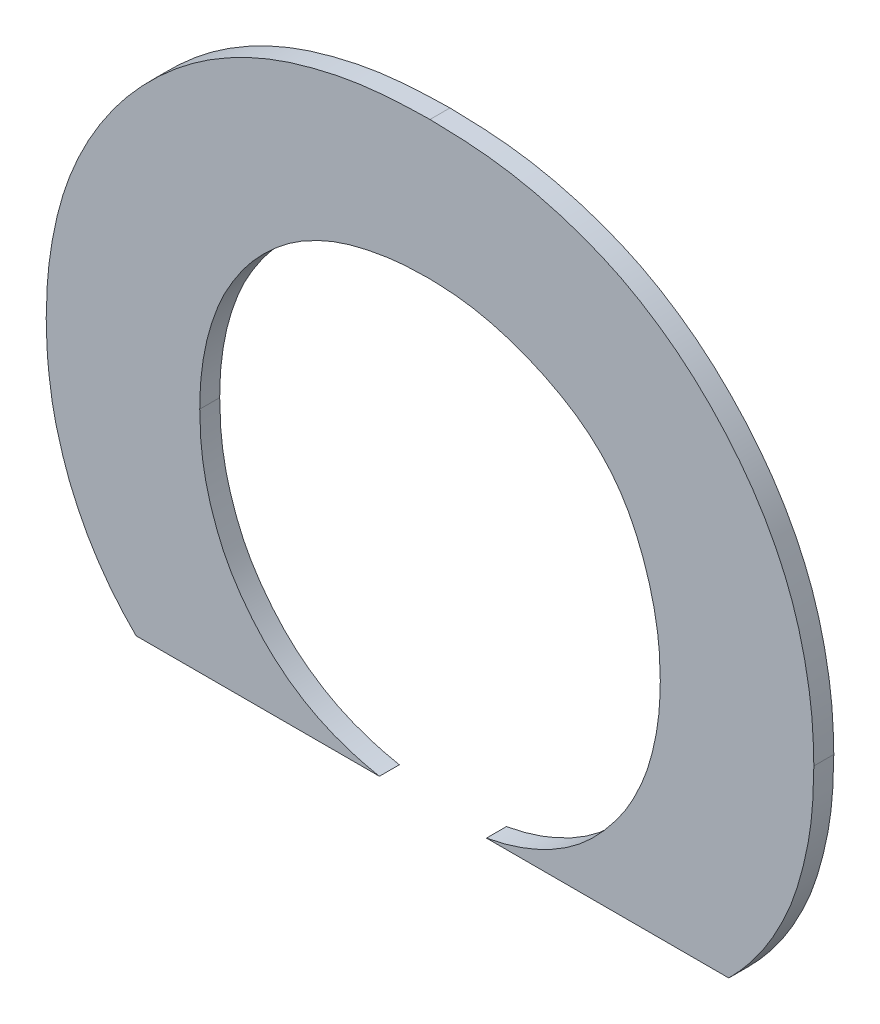
ISO-10303-21;
HEADER;
FILE_DESCRIPTION(('STEP AP214'),'2;1');
FILE_NAME('part.step','',(''),(''),'','','');
FILE_SCHEMA(('AUTOMOTIVE_DESIGN { 1 0 10303 214 1 1 1 1 }'));
ENDSEC;
DATA;
#1=APPLICATION_CONTEXT('core data for automotive mechanical design processes');
#2=APPLICATION_PROTOCOL_DEFINITION('international standard','automotive_design',2000,#1);
#3=PRODUCT_CONTEXT('',#1,'mechanical');
#4=PRODUCT('Part','Part','',(#3));
#5=PRODUCT_RELATED_PRODUCT_CATEGORY('part','',(#4));
#6=PRODUCT_DEFINITION_FORMATION('','',#4);
#7=PRODUCT_DEFINITION_CONTEXT('part definition',#1,'design');
#8=PRODUCT_DEFINITION('design','',#6,#7);
#9=PRODUCT_DEFINITION_SHAPE('','',#8);
#10=(LENGTH_UNIT() NAMED_UNIT(*) SI_UNIT(.MILLI.,.METRE.));
#11=(NAMED_UNIT(*) PLANE_ANGLE_UNIT() SI_UNIT($,.RADIAN.));
#12=(NAMED_UNIT(*) SI_UNIT($,.STERADIAN.) SOLID_ANGLE_UNIT());
#13=UNCERTAINTY_MEASURE_WITH_UNIT(LENGTH_MEASURE(1.E-05),#10,'distance_accuracy_value','');
#14=(GEOMETRIC_REPRESENTATION_CONTEXT(3) GLOBAL_UNCERTAINTY_ASSIGNED_CONTEXT((#13)) GLOBAL_UNIT_ASSIGNED_CONTEXT((#10,
#11,#12)) REPRESENTATION_CONTEXT('',''));
#15=CARTESIAN_POINT('',(0.,0.,0.));
#16=DIRECTION('',(0.,0.,1.));
#17=DIRECTION('',(1.,0.,0.));
#18=AXIS2_PLACEMENT_3D('',#15,#16,#17);
#19=CARTESIAN_POINT('',(9.61538461538461,6.16586538461538,0.5));
#20=CARTESIAN_POINT('',(9.61017162462908,5.92537714989007,0.5));
#21=CARTESIAN_POINT('',(9.59994283483099,5.45349762481903,0.5));
#22=CARTESIAN_POINT('',(9.53735152628781,4.76141097311679,0.5));
#23=CARTESIAN_POINT('',(9.41293172761239,4.10165799474069,0.5));
#24=CARTESIAN_POINT('',(9.25165458547047,3.47091623927967,0.5));
#25=CARTESIAN_POINT('',(9.05027258284493,2.86479504470434,0.5));
#26=CARTESIAN_POINT('',(8.78782313358665,2.2946738026183,0.5));
#27=CARTESIAN_POINT('',(8.48825548716103,1.74965475702828,0.5));
#28=CARTESIAN_POINT('',(8.13890804424135,1.23950736888458,0.5));
#29=CARTESIAN_POINT('',(7.74878978926781,0.764905096176397,0.5));
#30=CARTESIAN_POINT('',(7.31863403379012,0.328024675199994,0.5));
#31=CARTESIAN_POINT('',(6.84804691131166,-0.0675054423072277,0.5));
#32=CARTESIAN_POINT('',(6.34223694898483,-0.431443441327208,0.5));
#33=CARTESIAN_POINT('',(5.79254688724079,-0.750846054001856,0.5));
#34=CARTESIAN_POINT('',(5.20111588312258,-1.02413250883794,0.5));
#35=CARTESIAN_POINT('',(4.57631645930077,-1.26879451667326,0.5));
#36=CARTESIAN_POINT('',(4.13981509448959,-1.39186341674693,0.5));
#37=CARTESIAN_POINT('',(3.91826923076923,-1.45432692307692,0.5));
#38=B_SPLINE_CURVE_WITH_KNOTS('',3,(#19,#20,#21,#22,#23,#24,#25,#26,#27,#28,#29,#30,#31,#32,#33,
#34,#35,#36,#37),.UNSPECIFIED.,.F.,.F.,(4,1,1,1,1,1,1,1,1,1,1,1,1,1,1,1,4),(0.,
0.0698365772226825,0.137031447422229,0.201489536275066,0.264549454362492,0.32598430572815,
0.386637715872096,0.446522086796524,0.506375377576361,0.565880030210925,0.624695587639221,
0.684126282552749,0.744168630234222,0.805421484692506,0.868390132151238,0.933201533380567,1.),.UNSPECIFIED.);
#39=DIRECTION('',(0.,0.,1.));
#40=VECTOR('',#39,1.);
#41=SURFACE_OF_LINEAR_EXTRUSION('',#38,#40);
#42=CARTESIAN_POINT('',(9.61538461538461,6.16586538461538,1.));
#43=CARTESIAN_POINT('',(9.61017162462908,5.92537714989007,1.));
#44=CARTESIAN_POINT('',(9.59994283483099,5.45349762481903,1.));
#45=CARTESIAN_POINT('',(9.53735152628781,4.76141097311679,1.));
#46=CARTESIAN_POINT('',(9.41293172761239,4.10165799474069,1.));
#47=CARTESIAN_POINT('',(9.25165458547047,3.47091623927967,1.));
#48=CARTESIAN_POINT('',(9.05027258284493,2.86479504470434,1.));
#49=CARTESIAN_POINT('',(8.78782313358665,2.2946738026183,1.));
#50=CARTESIAN_POINT('',(8.48825548716103,1.74965475702828,1.));
#51=CARTESIAN_POINT('',(8.13890804424135,1.23950736888458,1.));
#52=CARTESIAN_POINT('',(7.74878978926781,0.764905096176397,1.));
#53=CARTESIAN_POINT('',(7.31863403379012,0.328024675199994,1.));
#54=CARTESIAN_POINT('',(6.84804691131166,-0.0675054423072277,1.));
#55=CARTESIAN_POINT('',(6.34223694898483,-0.431443441327208,1.));
#56=CARTESIAN_POINT('',(5.79254688724079,-0.750846054001856,1.));
#57=CARTESIAN_POINT('',(5.20111588312258,-1.02413250883794,1.));
#58=CARTESIAN_POINT('',(4.57631645930077,-1.26879451667326,1.));
#59=CARTESIAN_POINT('',(4.13981509448959,-1.39186341674693,1.));
#60=CARTESIAN_POINT('',(3.91826923076923,-1.45432692307692,1.));
#61=B_SPLINE_CURVE_WITH_KNOTS('',3,(#42,#43,#44,#45,#46,#47,#48,#49,#50,#51,#52,#53,#54,#55,#56,
#57,#58,#59,#60),.UNSPECIFIED.,.F.,.F.,(4,1,1,1,1,1,1,1,1,1,1,1,1,1,1,1,4),(0.,
0.0698365772226825,0.137031447422229,0.201489536275066,0.264549454362492,0.32598430572815,
0.386637715872096,0.446522086796524,0.506375377576361,0.565880030210925,0.624695587639221,
0.684126282552749,0.744168630234222,0.805421484692506,0.868390132151238,0.933201533380567,1.),.UNSPECIFIED.);
#62=CARTESIAN_POINT('',(9.61538461538461,6.16586538461538,1.));
#63=VERTEX_POINT('',#62);
#64=CARTESIAN_POINT('',(7.48417563612663,0.5,1.));
#65=VERTEX_POINT('',#64);
#66=EDGE_CURVE('E43',#63,#65,#61,.T.);
#67=ORIENTED_EDGE('',*,*,#66,.T.);
#68=DIRECTION('',(0.,0.,1.));
#69=VECTOR('',#68,1.);
#70=CARTESIAN_POINT('',(7.48417564454963,0.5,0.5));
#71=LINE('',#70,#69);
#72=CARTESIAN_POINT('',(7.48417563612663,0.5,0.5));
#73=VERTEX_POINT('',#72);
#74=EDGE_CURVE('E58',#65,#73,#71,.F.);
#75=ORIENTED_EDGE('',*,*,#74,.T.);
#76=CARTESIAN_POINT('',(9.61538461538461,6.16586538461538,0.5));
#77=VERTEX_POINT('',#76);
#78=EDGE_CURVE('E160',#77,#73,#38,.T.);
#79=ORIENTED_EDGE('',*,*,#78,.F.);
#80=DIRECTION('',(0.,0.,1.));
#81=VECTOR('',#80,1.);
#82=CARTESIAN_POINT('',(9.61538461538461,6.16586538461538,0.5));
#83=LINE('',#82,#81);
#84=EDGE_CURVE('E131',#77,#63,#83,.T.);
#85=ORIENTED_EDGE('',*,*,#84,.T.);
#86=EDGE_LOOP('',(#67,#75,#79,#85));
#87=FACE_BOUND('',#86,.T.);
#88=ADVANCED_FACE('F39',(#87),#41,.F.);
#89=CARTESIAN_POINT('',(-4.01442307692308,-1.45432692307692,0.5));
#90=CARTESIAN_POINT('',(-4.23841006147737,-1.37833581974484,0.5));
#91=CARTESIAN_POINT('',(-4.67732737328802,-1.22942622634854,0.5));
#92=CARTESIAN_POINT('',(-5.29744459104237,-0.939287095441452,0.5));
#93=CARTESIAN_POINT('',(-5.88122603721763,-0.629518404450239,0.5));
#94=CARTESIAN_POINT('',(-6.42816221732327,-0.285334654211241,0.5));
#95=CARTESIAN_POINT('',(-6.9303959427912,0.0974191148321524,0.5));
#96=CARTESIAN_POINT('',(-7.39139229300819,0.516962040217201,0.5));
#97=CARTESIAN_POINT('',(-7.81400813592569,0.967226277300411,0.5));
#98=CARTESIAN_POINT('',(-8.19167085803598,1.45566899472176,0.5));
#99=CARTESIAN_POINT('',(-8.52930715512637,1.97121734358262,0.5));
#100=CARTESIAN_POINT('',(-8.81698043243783,2.51588224428292,0.5));
#101=CARTESIAN_POINT('',(-9.06683521735972,3.08086066885602,0.5));
#102=CARTESIAN_POINT('',(-9.26066868043604,3.67448546647928,0.5));
#103=CARTESIAN_POINT('',(-9.42945911149872,4.28624964726649,0.5));
#104=CARTESIAN_POINT('',(-9.53195259419776,4.92718367191841,0.5));
#105=CARTESIAN_POINT('',(-9.60111763792179,5.58942430442754,0.5));
#106=CARTESIAN_POINT('',(-9.61057950921133,6.03947539948525,0.5));
#107=CARTESIAN_POINT('',(-9.61538461538462,6.26802884615384,0.5));
#108=B_SPLINE_CURVE_WITH_KNOTS('',3,(#89,#90,#91,#92,#93,#94,#95,#96,#97,#98,#99,#100,#101,#102,
#103,#104,#105,#106,#107),.UNSPECIFIED.,.F.,.F.,(4,1,1,1,1,1,1,1,1,1,1,1,1,1,1,1,4),(0.,
0.0690190400715999,0.135247374271586,0.199628646821953,0.261946501772838,0.323721121180078,
0.383768241952378,0.443781160830443,0.503808332866024,0.563841205217087,0.623508159508567,
0.683498266290824,0.743988251934363,0.805710225263784,0.868604717465862,0.933272366118071,1.),.UNSPECIFIED.);
#109=DIRECTION('',(0.,0.,1.));
#110=VECTOR('',#109,1.);
#111=SURFACE_OF_LINEAR_EXTRUSION('',#108,#110);
#112=CARTESIAN_POINT('',(-7.36253076665304,0.5,0.5));
#113=VERTEX_POINT('',#112);
#114=CARTESIAN_POINT('',(-9.61538461538462,6.26802884615384,0.5));
#115=VERTEX_POINT('',#114);
#116=EDGE_CURVE('E140',#113,#115,#108,.T.);
#117=ORIENTED_EDGE('',*,*,#116,.F.);
#118=DIRECTION('',(0.,0.,1.));
#119=VECTOR('',#118,1.);
#120=CARTESIAN_POINT('',(-7.3625307568974,0.5,0.5));
#121=LINE('',#120,#119);
#122=CARTESIAN_POINT('',(-7.36253076665304,0.5,1.));
#123=VERTEX_POINT('',#122);
#124=EDGE_CURVE('E125',#113,#123,#121,.T.);
#125=ORIENTED_EDGE('',*,*,#124,.T.);
#126=CARTESIAN_POINT('',(-4.01442307692308,-1.45432692307692,1.));
#127=CARTESIAN_POINT('',(-4.23841006147737,-1.37833581974484,1.));
#128=CARTESIAN_POINT('',(-4.67732737328802,-1.22942622634854,1.));
#129=CARTESIAN_POINT('',(-5.29744459104237,-0.939287095441452,1.));
#130=CARTESIAN_POINT('',(-5.88122603721763,-0.629518404450239,1.));
#131=CARTESIAN_POINT('',(-6.42816221732327,-0.285334654211241,1.));
#132=CARTESIAN_POINT('',(-6.9303959427912,0.0974191148321524,1.));
#133=CARTESIAN_POINT('',(-7.39139229300819,0.516962040217201,1.));
#134=CARTESIAN_POINT('',(-7.81400813592569,0.967226277300411,1.));
#135=CARTESIAN_POINT('',(-8.19167085803598,1.45566899472176,1.));
#136=CARTESIAN_POINT('',(-8.52930715512637,1.97121734358262,1.));
#137=CARTESIAN_POINT('',(-8.81698043243783,2.51588224428292,1.));
#138=CARTESIAN_POINT('',(-9.06683521735972,3.08086066885602,1.));
#139=CARTESIAN_POINT('',(-9.26066868043604,3.67448546647928,1.));
#140=CARTESIAN_POINT('',(-9.42945911149872,4.28624964726649,1.));
#141=CARTESIAN_POINT('',(-9.53195259419776,4.92718367191841,1.));
#142=CARTESIAN_POINT('',(-9.60111763792179,5.58942430442754,1.));
#143=CARTESIAN_POINT('',(-9.61057950921133,6.03947539948525,1.));
#144=CARTESIAN_POINT('',(-9.61538461538462,6.26802884615384,1.));
#145=B_SPLINE_CURVE_WITH_KNOTS('',3,(#126,#127,#128,#129,#130,#131,#132,#133,#134,#135,#136,
#137,#138,#139,#140,#141,#142,#143,#144),.UNSPECIFIED.,.F.,.F.,(4,1,1,1,1,1,1,1,1,1,1,1,1,1,1,1,
4),(0.,0.0690190400715999,0.135247374271586,0.199628646821953,0.261946501772838,
0.323721121180078,0.383768241952378,0.443781160830443,0.503808332866024,0.563841205217087,
0.623508159508567,0.683498266290824,0.743988251934363,0.805710225263784,0.868604717465862,
0.933272366118071,1.),.UNSPECIFIED.);
#146=CARTESIAN_POINT('',(-9.61538461538462,6.26802884615384,1.));
#147=VERTEX_POINT('',#146);
#148=EDGE_CURVE('E127',#123,#147,#145,.T.);
#149=ORIENTED_EDGE('',*,*,#148,.T.);
#150=DIRECTION('',(0.,0.,1.));
#151=VECTOR('',#150,1.);
#152=CARTESIAN_POINT('',(-9.61538461538462,6.26802884615384,0.5));
#153=LINE('',#152,#151);
#154=EDGE_CURVE('E147',#115,#147,#153,.T.);
#155=ORIENTED_EDGE('',*,*,#154,.F.);
#156=EDGE_LOOP('',(#117,#125,#149,#155));
#157=FACE_BOUND('',#156,.T.);
#158=ADVANCED_FACE('F143',(#157),#111,.F.);
#159=CARTESIAN_POINT('',(8.17034628619801,1.29686234703216,0.5));
#160=DIRECTION('',(0.,0.,1.));
#161=DIRECTION('',(1.,0.,0.));
#162=AXIS2_PLACEMENT_3D('',#159,#160,#161);
#163=PLANE('',#162);
#164=ORIENTED_EDGE('',*,*,#78,.T.);
#165=DIRECTION('',(-1.,0.,0.));
#166=VECTOR('',#165,1.);
#167=CARTESIAN_POINT('',(8.17034628619801,0.5,0.5));
#168=LINE('',#167,#166);
#169=CARTESIAN_POINT('',(1.41359819597285,0.499999999993376,0.5));
#170=VERTEX_POINT('',#169);
#171=EDGE_CURVE('E142',#73,#170,#168,.T.);
#172=ORIENTED_EDGE('',*,*,#171,.T.);
#173=CARTESIAN_POINT('',(0.0841346153846127,0.384615384615384,0.5));
#174=CARTESIAN_POINT('',(0.298741879628318,0.388503169415151,0.5));
#175=CARTESIAN_POINT('',(0.719438947245277,0.396124438296946,0.5));
#176=CARTESIAN_POINT('',(1.33067914523052,0.476876636018608,0.5));
#177=CARTESIAN_POINT('',(1.90902371745544,0.601588347185802,0.5));
#178=CARTESIAN_POINT('',(2.449089682021,0.781074464624901,0.5));
#179=CARTESIAN_POINT('',(2.95345777052598,1.01310213340004,0.5));
#180=CARTESIAN_POINT('',(3.42585671106122,1.28863408356051,0.5));
#181=CARTESIAN_POINT('',(3.861375885067,1.62209704558198,0.5));
#182=CARTESIAN_POINT('',(4.25527244275843,2.00634923869242,0.5));
#183=CARTESIAN_POINT('',(4.60713141860215,2.42801539449653,0.5));
#184=CARTESIAN_POINT('',(4.92581808877683,2.87129305470533,0.5));
#185=CARTESIAN_POINT('',(5.18030229737912,3.35163686209857,0.5));
#186=CARTESIAN_POINT('',(5.40192120420648,3.8492536392279,0.5));
#187=CARTESIAN_POINT('',(5.5604274130318,4.37747077233508,0.5));
#188=CARTESIAN_POINT('',(5.68253674841177,4.92533248383594,0.5));
#189=CARTESIAN_POINT('',(5.75614983057746,5.50081622561712,0.5));
#190=CARTESIAN_POINT('',(5.7648067262871,5.89321664760514,0.5));
#191=CARTESIAN_POINT('',(5.76923076923077,6.09375,0.5));
#192=B_SPLINE_CURVE_WITH_KNOTS('',3,(#173,#174,#175,#176,#177,#178,#179,#180,#181,#182,#183,
#184,#185,#186,#187,#188,#189,#190,#191),.UNSPECIFIED.,.F.,.F.,(4,1,1,1,1,1,1,1,1,1,1,1,1,1,1,1,
4),(0.,0.0709599727428106,0.139103643841149,0.203581362145137,0.266451970855359,
0.326948032336101,0.38695937404625,0.447003639778223,0.507930129174551,0.568600176092501,
0.628538288560351,0.688145756144646,0.748102184308101,0.808471065292475,0.870217415044338,
0.93367556356903,1.),.UNSPECIFIED.);
#193=CARTESIAN_POINT('',(5.76923076923077,6.09375,0.5));
#194=VERTEX_POINT('',#193);
#195=EDGE_CURVE('E182',#170,#194,#192,.T.);
#196=ORIENTED_EDGE('',*,*,#195,.T.);
#197=CARTESIAN_POINT('',(5.76923076923077,6.09375,0.5));
#198=CARTESIAN_POINT('',(5.76290998572883,6.34260485232519,0.5));
#199=CARTESIAN_POINT('',(5.75035306022847,6.83698214591475,0.5));
#200=CARTESIAN_POINT('',(5.63002917282379,7.57216822989461,0.5));
#201=CARTESIAN_POINT('',(5.43838958230219,8.29341635467748,0.5));
#202=CARTESIAN_POINT('',(5.17066883597334,8.99644998021517,0.5));
#203=CARTESIAN_POINT('',(4.81671116582285,9.66308412195336,0.5));
#204=CARTESIAN_POINT('',(4.33990592888762,10.2538832285914,0.5));
#205=CARTESIAN_POINT('',(3.75067850862052,10.7610507710305,0.5));
#206=CARTESIAN_POINT('',(3.06168113135891,11.1699046565707,0.5));
#207=CARTESIAN_POINT('',(2.32042835639894,11.5023402931136,0.5));
#208=CARTESIAN_POINT('',(1.55038509725538,11.7453473649888,0.5));
#209=CARTESIAN_POINT('',(0.765060284679938,11.8953217705654,0.5));
#210=CARTESIAN_POINT('',(0.235018362907529,11.9138241472058,0.5));
#211=CARTESIAN_POINT('',(-0.0300480769230803,11.9230769230769,0.5));
#212=B_SPLINE_CURVE_WITH_KNOTS('',3,(#197,#198,#199,#200,#201,#202,#203,#204,#205,#206,#207,
#208,#209,#210,#211),.UNSPECIFIED.,.F.,.F.,(4,1,1,1,1,1,1,1,1,1,1,1,4),(0.,0.0805069435077361,
0.159935819915266,0.240474099243913,0.32176598777039,0.403021655727952,0.483739879950997,
0.566036917680487,0.653342667413089,0.742166974909527,0.828513717498626,0.914242144790308,1.),.UNSPECIFIED.);
#213=CARTESIAN_POINT('',(-0.0300480769230803,11.9230769230769,0.5));
#214=VERTEX_POINT('',#213);
#215=EDGE_CURVE('E241',#194,#214,#212,.T.);
#216=ORIENTED_EDGE('',*,*,#215,.T.);
#217=CARTESIAN_POINT('',(-0.0300480769230803,11.9230769230769,0.5));
#218=CARTESIAN_POINT('',(-0.248669845909435,11.9193728915779,0.5));
#219=CARTESIAN_POINT('',(-0.673389620613419,11.9121770142824,0.5));
#220=CARTESIAN_POINT('',(-1.29250700382301,11.829974924845,0.5));
#221=CARTESIAN_POINT('',(-1.87582204082723,11.7051962310461,0.5));
#222=CARTESIAN_POINT('',(-2.42616153492517,11.5342807412655,0.5));
#223=CARTESIAN_POINT('',(-2.93487766673903,11.2998289907436,0.5));
#224=CARTESIAN_POINT('',(-3.41330013509986,11.0273968609747,0.5));
#225=CARTESIAN_POINT('',(-3.84795922931062,10.6897621955847,0.5));
#226=CARTESIAN_POINT('',(-4.24821332100134,10.3134232856603,0.5));
#227=CARTESIAN_POINT('',(-4.61067412157418,9.90131011816799,0.5));
#228=CARTESIAN_POINT('',(-4.91480150735509,9.45100822898077,0.5));
#229=CARTESIAN_POINT('',(-5.18565589403081,8.98282430200924,0.5));
#230=CARTESIAN_POINT('',(-5.39289475383531,8.47764004794334,0.5));
#231=CARTESIAN_POINT('',(-5.56290468410543,7.94969461966001,0.5));
#232=CARTESIAN_POINT('',(-5.6818083223503,7.39407427831202,0.5));
#233=CARTESIAN_POINT('',(-5.75633311374404,6.81293285109098,0.5));
#234=CARTESIAN_POINT('',(-5.76486924148169,6.41649957704712,0.5));
#235=CARTESIAN_POINT('',(-5.76923076923077,6.21394230769231,0.5));
#236=B_SPLINE_CURVE_WITH_KNOTS('',3,(#217,#218,#219,#220,#221,#222,#223,#224,#225,#226,#227,
#228,#229,#230,#231,#232,#233,#234,#235),.UNSPECIFIED.,.F.,.F.,(4,1,1,1,1,1,1,1,1,1,1,1,1,1,1,1,
4),(0.,0.0718484706460557,0.139581096645153,0.204956881044388,0.267870378858521,
0.328601075133081,0.388818752229674,0.44850082876977,0.509081298697064,0.569313385383979,
0.628513676028271,0.687504706362744,0.746840437638776,0.807671078702693,0.869688495283006,
0.933417439228192,1.),.UNSPECIFIED.);
#237=CARTESIAN_POINT('',(-5.76923076923077,6.21394230769231,0.5));
#238=VERTEX_POINT('',#237);
#239=EDGE_CURVE('E249',#214,#238,#236,.T.);
#240=ORIENTED_EDGE('',*,*,#239,.T.);
#241=CARTESIAN_POINT('',(-5.76923076923077,6.21394230769231,0.5));
#242=CARTESIAN_POINT('',(-5.76472876229037,6.00740881322016,0.5));
#243=CARTESIAN_POINT('',(-5.75591454983093,5.60304913000162,0.5));
#244=CARTESIAN_POINT('',(-5.68325287549839,5.00915639995905,0.5));
#245=CARTESIAN_POINT('',(-5.55752550814308,4.44374160281196,0.5));
#246=CARTESIAN_POINT('',(-5.37988154491874,3.90636758849762,0.5));
#247=CARTESIAN_POINT('',(-5.16696790728403,3.39146805741067,0.5));
#248=CARTESIAN_POINT('',(-4.89251856072889,2.90681127119841,0.5));
#249=CARTESIAN_POINT('',(-4.56704456729155,2.45250364901925,0.5));
#250=CARTESIAN_POINT('',(-4.20246036337263,2.02461965841508,0.5));
#251=CARTESIAN_POINT('',(-3.79274641929303,1.63792724526219,0.5));
#252=CARTESIAN_POINT('',(-3.34218491099058,1.30278843413201,0.5));
#253=CARTESIAN_POINT('',(-2.85757334968177,1.01630437083754,0.5));
#254=CARTESIAN_POINT('',(-2.33584039688776,0.788587125715625,0.5));
#255=CARTESIAN_POINT('',(-1.78020581013479,0.608062689845343,0.5));
#256=CARTESIAN_POINT('',(-1.19095527567445,0.476316053333942,0.5));
#257=CARTESIAN_POINT('',(-0.565131156290697,0.395925782660893,0.5));
#258=CARTESIAN_POINT('',(-0.136466308565069,0.388458316690241,0.5));
#259=CARTESIAN_POINT('',(0.0841346153846127,0.384615384615384,0.5));
#260=B_SPLINE_CURVE_WITH_KNOTS('',3,(#241,#242,#243,#244,#245,#246,#247,#248,#249,#250,#251,
#252,#253,#254,#255,#256,#257,#258,#259),.UNSPECIFIED.,.F.,.F.,(4,1,1,1,1,1,1,1,1,1,1,1,1,1,1,1,
4),(0.,0.0666070016318741,0.130405899289292,0.192644410133481,0.253130712904114,
0.312779373663437,0.372091073304311,0.432335277716802,0.492821580487436,0.553162740803763,
0.61364559184941,0.673601470030492,0.734356403150653,0.796886070333001,0.861788051101126,
0.928872909010974,1.),.UNSPECIFIED.);
#261=CARTESIAN_POINT('',(-1.26850264164597,0.5,0.5));
#262=VERTEX_POINT('',#261);
#263=EDGE_CURVE('E141',#238,#262,#260,.T.);
#264=ORIENTED_EDGE('',*,*,#263,.T.);
#265=EDGE_CURVE('E79',#262,#113,#168,.T.);
#266=ORIENTED_EDGE('',*,*,#265,.T.);
#267=ORIENTED_EDGE('',*,*,#116,.T.);
#268=CARTESIAN_POINT('',(-9.61538461538462,6.26802884615384,0.5));
#269=CARTESIAN_POINT('',(-9.60773414555753,6.5830020096701,0.5));
#270=CARTESIAN_POINT('',(-9.59266213693647,7.20352314670035,0.5));
#271=CARTESIAN_POINT('',(-9.46045808711413,8.1144324090723,0.5));
#272=CARTESIAN_POINT('',(-9.25990339793953,8.98926529780998,0.5));
#273=CARTESIAN_POINT('',(-8.96996264021622,9.82364137850103,0.5));
#274=CARTESIAN_POINT('',(-8.59243318400993,10.6178012582082,0.5));
#275=CARTESIAN_POINT('',(-8.13548216286417,11.3747125671359,0.5));
#276=CARTESIAN_POINT('',(-7.59768042116446,12.0948991148896,0.5));
#277=CARTESIAN_POINT('',(-6.97796654214632,12.7656808720182,0.5));
#278=CARTESIAN_POINT('',(-6.29416438547703,13.3805060982265,0.5));
#279=CARTESIAN_POINT('',(-5.55028272473663,13.9210453215166,0.5));
#280=CARTESIAN_POINT('',(-4.75023050531947,14.371943555626,0.5));
#281=CARTESIAN_POINT('',(-3.90261710589693,14.7487378620928,0.5));
#282=CARTESIAN_POINT('',(-2.99696341803071,15.0264532890674,0.5));
#283=CARTESIAN_POINT('',(-2.04585533191998,15.2418928252683,0.5));
#284=CARTESIAN_POINT('',(-1.03859321259075,15.3592838645668,0.5));
#285=CARTESIAN_POINT('',(-0.350836160649459,15.376058412425,0.5));
#286=CARTESIAN_POINT('',(0.,15.3846153846154,0.5));
#287=B_SPLINE_CURVE_WITH_KNOTS('',3,(#268,#269,#270,#271,#272,#273,#274,#275,#276,#277,#278,
#279,#280,#281,#282,#283,#284,#285,#286),.UNSPECIFIED.,.F.,.F.,(4,1,1,1,1,1,1,1,1,1,1,1,1,1,1,1,
4),(0.,0.0636016018393533,0.125300002862829,0.185573684726374,0.244704757427481,
0.303358874746022,0.362909478615888,0.423048500914777,0.484628658573489,0.547107882741485,
0.608550912896698,0.669992610216844,0.732328802589925,0.79555849225572,0.861051753754884,
0.929120218972654,1.),.UNSPECIFIED.);
#288=CARTESIAN_POINT('',(0.,15.3846153846154,0.5));
#289=VERTEX_POINT('',#288);
#290=EDGE_CURVE('E149',#115,#289,#287,.T.);
#291=ORIENTED_EDGE('',*,*,#290,.T.);
#292=CARTESIAN_POINT('',(0.,15.3846153846154,0.5));
#293=CARTESIAN_POINT('',(0.350860478588129,15.3761270559769,0.5));
#294=CARTESIAN_POINT('',(1.03866520188058,15.3594870726025,0.5));
#295=CARTESIAN_POINT('',(2.04558496105687,15.2411296349084,0.5));
#296=CARTESIAN_POINT('',(2.99851656975415,15.0290259291801,0.5));
#297=CARTESIAN_POINT('',(3.89958189921897,14.7389177862195,0.5));
#298=CARTESIAN_POINT('',(4.75380344436229,14.3752165022203,0.5));
#299=CARTESIAN_POINT('',(5.5480754872625,13.9130915980736,0.5));
#300=CARTESIAN_POINT('',(6.29395990316527,13.3768224134789,0.5));
#301=CARTESIAN_POINT('',(6.97427307151287,12.7574652592149,0.5));
#302=CARTESIAN_POINT('',(7.5912434451864,12.0808664522285,0.5));
#303=CARTESIAN_POINT('',(8.13618140702489,11.3585049332575,0.5));
#304=CARTESIAN_POINT('',(8.59360039642952,10.5920957537108,0.5));
#305=CARTESIAN_POINT('',(8.97132285020014,9.78578242219193,0.5));
#306=CARTESIAN_POINT('',(9.25878367827988,8.93661445351061,0.5));
#307=CARTESIAN_POINT('',(9.46064239270897,8.04829233280908,0.5));
#308=CARTESIAN_POINT('',(9.59317824745516,7.12135523530423,0.5));
#309=CARTESIAN_POINT('',(9.60787819058732,6.48884988759901,0.5));
#310=CARTESIAN_POINT('',(9.61538461538461,6.16586538461538,0.5));
#311=B_SPLINE_CURVE_WITH_KNOTS('',3,(#292,#293,#294,#295,#296,#297,#298,#299,#300,#301,#302,
#303,#304,#305,#306,#307,#308,#309,#310),.UNSPECIFIED.,.F.,.F.,(4,1,1,1,1,1,1,1,1,1,1,1,1,1,1,1,
4),(0.,0.0704457562836281,0.138097411548782,0.203189632079346,0.266154309501603,
0.327947985631828,0.389213152644785,0.450279942989013,0.512077546225795,0.573577290012189,
0.633911119054888,0.6934418558982,0.752464940109226,0.812374943731128,0.873063031946234,
0.935180510827551,1.),.UNSPECIFIED.);
#312=EDGE_CURVE('E148',#289,#77,#311,.T.);
#313=ORIENTED_EDGE('',*,*,#312,.T.);
#314=EDGE_LOOP('',(#164,#172,#196,#216,#240,#264,#266,#267,#291,#313));
#315=FACE_BOUND('',#314,.T.);
#316=ADVANCED_FACE('F136',(#315),#163,.F.);
#317=CARTESIAN_POINT('',(8.17034628619801,1.29686234703216,1.));
#318=DIRECTION('',(0.,0.,1.));
#319=DIRECTION('',(1.,0.,0.));
#320=AXIS2_PLACEMENT_3D('',#317,#318,#319);
#321=PLANE('',#320);
#322=ORIENTED_EDGE('',*,*,#148,.F.);
#323=DIRECTION('',(1.,0.,0.));
#324=VECTOR('',#323,1.);
#325=CARTESIAN_POINT('',(-17.,0.5,1.));
#326=LINE('',#325,#324);
#327=CARTESIAN_POINT('',(-1.26850264164597,0.5,1.));
#328=VERTEX_POINT('',#327);
#329=EDGE_CURVE('E128',#123,#328,#326,.T.);
#330=ORIENTED_EDGE('',*,*,#329,.T.);
#331=CARTESIAN_POINT('',(-5.76923076923077,6.21394230769231,1.));
#332=CARTESIAN_POINT('',(-5.76472876229037,6.00740881322016,1.));
#333=CARTESIAN_POINT('',(-5.75591454983093,5.60304913000162,1.));
#334=CARTESIAN_POINT('',(-5.68325287549839,5.00915639995905,1.));
#335=CARTESIAN_POINT('',(-5.55752550814308,4.44374160281196,1.));
#336=CARTESIAN_POINT('',(-5.37988154491874,3.90636758849762,1.));
#337=CARTESIAN_POINT('',(-5.16696790728403,3.39146805741067,1.));
#338=CARTESIAN_POINT('',(-4.89251856072889,2.90681127119841,1.));
#339=CARTESIAN_POINT('',(-4.56704456729155,2.45250364901925,1.));
#340=CARTESIAN_POINT('',(-4.20246036337263,2.02461965841508,1.));
#341=CARTESIAN_POINT('',(-3.79274641929303,1.63792724526219,1.));
#342=CARTESIAN_POINT('',(-3.34218491099058,1.30278843413201,1.));
#343=CARTESIAN_POINT('',(-2.85757334968177,1.01630437083754,1.));
#344=CARTESIAN_POINT('',(-2.33584039688776,0.788587125715625,1.));
#345=CARTESIAN_POINT('',(-1.78020581013479,0.608062689845343,1.));
#346=CARTESIAN_POINT('',(-1.19095527567445,0.476316053333942,1.));
#347=CARTESIAN_POINT('',(-0.565131156290697,0.395925782660893,1.));
#348=CARTESIAN_POINT('',(-0.136466308565069,0.388458316690241,1.));
#349=CARTESIAN_POINT('',(0.0841346153846127,0.384615384615384,1.));
#350=B_SPLINE_CURVE_WITH_KNOTS('',3,(#331,#332,#333,#334,#335,#336,#337,#338,#339,#340,#341,
#342,#343,#344,#345,#346,#347,#348,#349),.UNSPECIFIED.,.F.,.F.,(4,1,1,1,1,1,1,1,1,1,1,1,1,1,1,1,
4),(0.,0.0666070016318741,0.130405899289292,0.192644410133481,0.253130712904114,
0.312779373663437,0.372091073304311,0.432335277716802,0.492821580487436,0.553162740803763,
0.61364559184941,0.673601470030492,0.734356403150653,0.796886070333001,0.861788051101126,
0.928872909010974,1.),.UNSPECIFIED.);
#351=CARTESIAN_POINT('',(-5.76923076923077,6.21394230769231,1.));
#352=VERTEX_POINT('',#351);
#353=EDGE_CURVE('E191',#352,#328,#350,.T.);
#354=ORIENTED_EDGE('',*,*,#353,.F.);
#355=CARTESIAN_POINT('',(-0.0300480769230803,11.9230769230769,1.));
#356=CARTESIAN_POINT('',(-0.248669845909435,11.9193728915779,1.));
#357=CARTESIAN_POINT('',(-0.673389620613419,11.9121770142824,1.));
#358=CARTESIAN_POINT('',(-1.29250700382301,11.829974924845,1.));
#359=CARTESIAN_POINT('',(-1.87582204082723,11.7051962310461,1.));
#360=CARTESIAN_POINT('',(-2.42616153492517,11.5342807412655,1.));
#361=CARTESIAN_POINT('',(-2.93487766673903,11.2998289907436,1.));
#362=CARTESIAN_POINT('',(-3.41330013509986,11.0273968609747,1.));
#363=CARTESIAN_POINT('',(-3.84795922931062,10.6897621955847,1.));
#364=CARTESIAN_POINT('',(-4.24821332100134,10.3134232856603,1.));
#365=CARTESIAN_POINT('',(-4.61067412157418,9.90131011816799,1.));
#366=CARTESIAN_POINT('',(-4.91480150735509,9.45100822898077,1.));
#367=CARTESIAN_POINT('',(-5.18565589403081,8.98282430200924,1.));
#368=CARTESIAN_POINT('',(-5.39289475383531,8.47764004794334,1.));
#369=CARTESIAN_POINT('',(-5.56290468410543,7.94969461966001,1.));
#370=CARTESIAN_POINT('',(-5.6818083223503,7.39407427831202,1.));
#371=CARTESIAN_POINT('',(-5.75633311374404,6.81293285109098,1.));
#372=CARTESIAN_POINT('',(-5.76486924148169,6.41649957704712,1.));
#373=CARTESIAN_POINT('',(-5.76923076923077,6.21394230769231,1.));
#374=B_SPLINE_CURVE_WITH_KNOTS('',3,(#355,#356,#357,#358,#359,#360,#361,#362,#363,#364,#365,
#366,#367,#368,#369,#370,#371,#372,#373),.UNSPECIFIED.,.F.,.F.,(4,1,1,1,1,1,1,1,1,1,1,1,1,1,1,1,
4),(0.,0.0718484706460557,0.139581096645153,0.204956881044388,0.267870378858521,
0.328601075133081,0.388818752229674,0.44850082876977,0.509081298697064,0.569313385383979,
0.628513676028271,0.687504706362744,0.746840437638776,0.807671078702693,0.869688495283006,
0.933417439228192,1.),.UNSPECIFIED.);
#375=CARTESIAN_POINT('',(-0.0300480769230803,11.9230769230769,1.));
#376=VERTEX_POINT('',#375);
#377=EDGE_CURVE('E416',#376,#352,#374,.T.);
#378=ORIENTED_EDGE('',*,*,#377,.F.);
#379=CARTESIAN_POINT('',(5.76923076923077,6.09375,1.));
#380=CARTESIAN_POINT('',(5.76290998572883,6.34260485232519,1.));
#381=CARTESIAN_POINT('',(5.75035306022847,6.83698214591475,1.));
#382=CARTESIAN_POINT('',(5.63002917282379,7.57216822989461,1.));
#383=CARTESIAN_POINT('',(5.43838958230219,8.29341635467748,1.));
#384=CARTESIAN_POINT('',(5.17066883597334,8.99644998021517,1.));
#385=CARTESIAN_POINT('',(4.81671116582285,9.66308412195336,1.));
#386=CARTESIAN_POINT('',(4.33990592888762,10.2538832285914,1.));
#387=CARTESIAN_POINT('',(3.75067850862052,10.7610507710305,1.));
#388=CARTESIAN_POINT('',(3.06168113135891,11.1699046565707,1.));
#389=CARTESIAN_POINT('',(2.32042835639894,11.5023402931136,1.));
#390=CARTESIAN_POINT('',(1.55038509725538,11.7453473649888,1.));
#391=CARTESIAN_POINT('',(0.765060284679938,11.8953217705654,1.));
#392=CARTESIAN_POINT('',(0.235018362907529,11.9138241472058,1.));
#393=CARTESIAN_POINT('',(-0.0300480769230803,11.9230769230769,1.));
#394=B_SPLINE_CURVE_WITH_KNOTS('',3,(#379,#380,#381,#382,#383,#384,#385,#386,#387,#388,#389,
#390,#391,#392,#393),.UNSPECIFIED.,.F.,.F.,(4,1,1,1,1,1,1,1,1,1,1,1,4),(0.,0.0805069435077361,
0.159935819915266,0.240474099243913,0.32176598777039,0.403021655727952,0.483739879950997,
0.566036917680487,0.653342667413089,0.742166974909527,0.828513717498626,0.914242144790308,1.),.UNSPECIFIED.);
#395=CARTESIAN_POINT('',(5.76923076923077,6.09375,1.));
#396=VERTEX_POINT('',#395);
#397=EDGE_CURVE('E51',#396,#376,#394,.T.);
#398=ORIENTED_EDGE('',*,*,#397,.F.);
#399=CARTESIAN_POINT('',(0.0841346153846127,0.384615384615384,1.));
#400=CARTESIAN_POINT('',(0.298741879628318,0.388503169415151,1.));
#401=CARTESIAN_POINT('',(0.719438947245277,0.396124438296946,1.));
#402=CARTESIAN_POINT('',(1.33067914523052,0.476876636018608,1.));
#403=CARTESIAN_POINT('',(1.90902371745544,0.601588347185802,1.));
#404=CARTESIAN_POINT('',(2.449089682021,0.781074464624901,1.));
#405=CARTESIAN_POINT('',(2.95345777052598,1.01310213340004,1.));
#406=CARTESIAN_POINT('',(3.42585671106122,1.28863408356051,1.));
#407=CARTESIAN_POINT('',(3.861375885067,1.62209704558198,1.));
#408=CARTESIAN_POINT('',(4.25527244275843,2.00634923869242,1.));
#409=CARTESIAN_POINT('',(4.60713141860215,2.42801539449653,1.));
#410=CARTESIAN_POINT('',(4.92581808877683,2.87129305470533,1.));
#411=CARTESIAN_POINT('',(5.18030229737912,3.35163686209857,1.));
#412=CARTESIAN_POINT('',(5.40192120420648,3.8492536392279,1.));
#413=CARTESIAN_POINT('',(5.5604274130318,4.37747077233508,1.));
#414=CARTESIAN_POINT('',(5.68253674841177,4.92533248383594,1.));
#415=CARTESIAN_POINT('',(5.75614983057746,5.50081622561712,1.));
#416=CARTESIAN_POINT('',(5.7648067262871,5.89321664760514,1.));
#417=CARTESIAN_POINT('',(5.76923076923077,6.09375,1.));
#418=B_SPLINE_CURVE_WITH_KNOTS('',3,(#399,#400,#401,#402,#403,#404,#405,#406,#407,#408,#409,
#410,#411,#412,#413,#414,#415,#416,#417),.UNSPECIFIED.,.F.,.F.,(4,1,1,1,1,1,1,1,1,1,1,1,1,1,1,1,
4),(0.,0.0709599727428106,0.139103643841149,0.203581362145137,0.266451970855359,
0.326948032336101,0.38695937404625,0.447003639778223,0.507930129174551,0.568600176092501,
0.628538288560351,0.688145756144646,0.748102184308101,0.808471065292475,0.870217415044338,
0.93367556356903,1.),.UNSPECIFIED.);
#419=CARTESIAN_POINT('',(1.41359819597285,0.499999999993376,1.));
#420=VERTEX_POINT('',#419);
#421=EDGE_CURVE('E188',#420,#396,#418,.T.);
#422=ORIENTED_EDGE('',*,*,#421,.F.);
#423=EDGE_CURVE('E122',#420,#65,#326,.T.);
#424=ORIENTED_EDGE('',*,*,#423,.T.);
#425=ORIENTED_EDGE('',*,*,#66,.F.);
#426=CARTESIAN_POINT('',(0.,15.3846153846154,1.));
#427=CARTESIAN_POINT('',(0.350860478588129,15.3761270559769,1.));
#428=CARTESIAN_POINT('',(1.03866520188058,15.3594870726025,1.));
#429=CARTESIAN_POINT('',(2.04558496105687,15.2411296349084,1.));
#430=CARTESIAN_POINT('',(2.99851656975415,15.0290259291801,1.));
#431=CARTESIAN_POINT('',(3.89958189921897,14.7389177862195,1.));
#432=CARTESIAN_POINT('',(4.75380344436229,14.3752165022203,1.));
#433=CARTESIAN_POINT('',(5.5480754872625,13.9130915980736,1.));
#434=CARTESIAN_POINT('',(6.29395990316527,13.3768224134789,1.));
#435=CARTESIAN_POINT('',(6.97427307151287,12.7574652592149,1.));
#436=CARTESIAN_POINT('',(7.5912434451864,12.0808664522285,1.));
#437=CARTESIAN_POINT('',(8.13618140702489,11.3585049332575,1.));
#438=CARTESIAN_POINT('',(8.59360039642952,10.5920957537108,1.));
#439=CARTESIAN_POINT('',(8.97132285020014,9.78578242219193,1.));
#440=CARTESIAN_POINT('',(9.25878367827988,8.93661445351061,1.));
#441=CARTESIAN_POINT('',(9.46064239270897,8.04829233280908,1.));
#442=CARTESIAN_POINT('',(9.59317824745516,7.12135523530423,1.));
#443=CARTESIAN_POINT('',(9.60787819058732,6.48884988759901,1.));
#444=CARTESIAN_POINT('',(9.61538461538461,6.16586538461538,1.));
#445=B_SPLINE_CURVE_WITH_KNOTS('',3,(#426,#427,#428,#429,#430,#431,#432,#433,#434,#435,#436,
#437,#438,#439,#440,#441,#442,#443,#444),.UNSPECIFIED.,.F.,.F.,(4,1,1,1,1,1,1,1,1,1,1,1,1,1,1,1,
4),(0.,0.0704457562836281,0.138097411548782,0.203189632079346,0.266154309501603,
0.327947985631828,0.389213152644785,0.450279942989013,0.512077546225795,0.573577290012189,
0.633911119054888,0.6934418558982,0.752464940109226,0.812374943731128,0.873063031946234,
0.935180510827551,1.),.UNSPECIFIED.);
#446=CARTESIAN_POINT('',(0.,15.3846153846154,1.));
#447=VERTEX_POINT('',#446);
#448=EDGE_CURVE('E199',#447,#63,#445,.T.);
#449=ORIENTED_EDGE('',*,*,#448,.F.);
#450=CARTESIAN_POINT('',(-9.61538461538462,6.26802884615384,1.));
#451=CARTESIAN_POINT('',(-9.60773414555753,6.5830020096701,1.));
#452=CARTESIAN_POINT('',(-9.59266213693647,7.20352314670035,1.));
#453=CARTESIAN_POINT('',(-9.46045808711413,8.1144324090723,1.));
#454=CARTESIAN_POINT('',(-9.25990339793953,8.98926529780998,1.));
#455=CARTESIAN_POINT('',(-8.96996264021622,9.82364137850103,1.));
#456=CARTESIAN_POINT('',(-8.59243318400993,10.6178012582082,1.));
#457=CARTESIAN_POINT('',(-8.13548216286417,11.3747125671359,1.));
#458=CARTESIAN_POINT('',(-7.59768042116446,12.0948991148896,1.));
#459=CARTESIAN_POINT('',(-6.97796654214632,12.7656808720182,1.));
#460=CARTESIAN_POINT('',(-6.29416438547703,13.3805060982265,1.));
#461=CARTESIAN_POINT('',(-5.55028272473663,13.9210453215166,1.));
#462=CARTESIAN_POINT('',(-4.75023050531947,14.371943555626,1.));
#463=CARTESIAN_POINT('',(-3.90261710589693,14.7487378620928,1.));
#464=CARTESIAN_POINT('',(-2.99696341803071,15.0264532890674,1.));
#465=CARTESIAN_POINT('',(-2.04585533191998,15.2418928252683,1.));
#466=CARTESIAN_POINT('',(-1.03859321259075,15.3592838645668,1.));
#467=CARTESIAN_POINT('',(-0.350836160649459,15.376058412425,1.));
#468=CARTESIAN_POINT('',(0.,15.3846153846154,1.));
#469=B_SPLINE_CURVE_WITH_KNOTS('',3,(#450,#451,#452,#453,#454,#455,#456,#457,#458,#459,#460,
#461,#462,#463,#464,#465,#466,#467,#468),.UNSPECIFIED.,.F.,.F.,(4,1,1,1,1,1,1,1,1,1,1,1,1,1,1,1,
4),(0.,0.0636016018393533,0.125300002862829,0.185573684726374,0.244704757427481,
0.303358874746022,0.362909478615888,0.423048500914777,0.484628658573489,0.547107882741485,
0.608550912896698,0.669992610216844,0.732328802589925,0.79555849225572,0.861051753754884,
0.929120218972654,1.),.UNSPECIFIED.);
#470=EDGE_CURVE('E210',#147,#447,#469,.T.);
#471=ORIENTED_EDGE('',*,*,#470,.F.);
#472=EDGE_LOOP('',(#322,#330,#354,#378,#398,#422,#424,#425,#449,#471));
#473=FACE_BOUND('',#472,.T.);
#474=ADVANCED_FACE('F41',(#473),#321,.T.);
#475=DIRECTION('',(0.,0.,1.));
#476=VECTOR('',#475,1.);
#477=SURFACE_OF_LINEAR_EXTRUSION('',#287,#476);
#478=ORIENTED_EDGE('',*,*,#470,.T.);
#479=DIRECTION('',(0.,0.,1.));
#480=VECTOR('',#479,1.);
#481=CARTESIAN_POINT('',(0.,15.3846153846154,0.5));
#482=LINE('',#481,#480);
#483=EDGE_CURVE('E189',#289,#447,#482,.T.);
#484=ORIENTED_EDGE('',*,*,#483,.F.);
#485=ORIENTED_EDGE('',*,*,#290,.F.);
#486=ORIENTED_EDGE('',*,*,#154,.T.);
#487=EDGE_LOOP('',(#478,#484,#485,#486));
#488=FACE_BOUND('',#487,.T.);
#489=ADVANCED_FACE('F232',(#488),#477,.F.);
#490=DIRECTION('',(0.,0.,1.));
#491=VECTOR('',#490,1.);
#492=SURFACE_OF_LINEAR_EXTRUSION('',#311,#491);
#493=ORIENTED_EDGE('',*,*,#448,.T.);
#494=ORIENTED_EDGE('',*,*,#84,.F.);
#495=ORIENTED_EDGE('',*,*,#312,.F.);
#496=ORIENTED_EDGE('',*,*,#483,.T.);
#497=EDGE_LOOP('',(#493,#494,#495,#496));
#498=FACE_BOUND('',#497,.T.);
#499=ADVANCED_FACE('F228',(#498),#492,.F.);
#500=DIRECTION('',(0.,0.,1.));
#501=VECTOR('',#500,1.);
#502=SURFACE_OF_LINEAR_EXTRUSION('',#192,#501);
#503=ORIENTED_EDGE('',*,*,#195,.F.);
#504=DIRECTION('',(0.,0.,1.));
#505=VECTOR('',#504,1.);
#506=CARTESIAN_POINT('',(1.41359819597285,0.499999999993376,0.5));
#507=LINE('',#506,#505);
#508=EDGE_CURVE('E118',#170,#420,#507,.T.);
#509=ORIENTED_EDGE('',*,*,#508,.T.);
#510=ORIENTED_EDGE('',*,*,#421,.T.);
#511=DIRECTION('',(0.,0.,1.));
#512=VECTOR('',#511,1.);
#513=CARTESIAN_POINT('',(5.76923076923077,6.09375,0.5));
#514=LINE('',#513,#512);
#515=EDGE_CURVE('E11',#194,#396,#514,.T.);
#516=ORIENTED_EDGE('',*,*,#515,.F.);
#517=EDGE_LOOP('',(#503,#509,#510,#516));
#518=FACE_BOUND('',#517,.T.);
#519=ADVANCED_FACE('F235',(#518),#502,.F.);
#520=DIRECTION('',(0.,0.,1.));
#521=VECTOR('',#520,1.);
#522=SURFACE_OF_LINEAR_EXTRUSION('',#260,#521);
#523=ORIENTED_EDGE('',*,*,#353,.T.);
#524=DIRECTION('',(0.,0.,1.));
#525=VECTOR('',#524,1.);
#526=CARTESIAN_POINT('',(-1.26850264164597,0.5,0.5));
#527=LINE('',#526,#525);
#528=EDGE_CURVE('E71',#328,#262,#527,.F.);
#529=ORIENTED_EDGE('',*,*,#528,.T.);
#530=ORIENTED_EDGE('',*,*,#263,.F.);
#531=DIRECTION('',(0.,0.,1.));
#532=VECTOR('',#531,1.);
#533=CARTESIAN_POINT('',(-5.76923076923077,6.21394230769231,0.5));
#534=LINE('',#533,#532);
#535=EDGE_CURVE('E422',#238,#352,#534,.T.);
#536=ORIENTED_EDGE('',*,*,#535,.T.);
#537=EDGE_LOOP('',(#523,#529,#530,#536));
#538=FACE_BOUND('',#537,.T.);
#539=ADVANCED_FACE('F237',(#538),#522,.F.);
#540=DIRECTION('',(0.,0.,1.));
#541=VECTOR('',#540,1.);
#542=SURFACE_OF_LINEAR_EXTRUSION('',#236,#541);
#543=ORIENTED_EDGE('',*,*,#377,.T.);
#544=ORIENTED_EDGE('',*,*,#535,.F.);
#545=ORIENTED_EDGE('',*,*,#239,.F.);
#546=DIRECTION('',(0.,0.,1.));
#547=VECTOR('',#546,1.);
#548=CARTESIAN_POINT('',(-0.0300480769230803,11.9230769230769,0.5));
#549=LINE('',#548,#547);
#550=EDGE_CURVE('E417',#214,#376,#549,.T.);
#551=ORIENTED_EDGE('',*,*,#550,.T.);
#552=EDGE_LOOP('',(#543,#544,#545,#551));
#553=FACE_BOUND('',#552,.T.);
#554=ADVANCED_FACE('F238',(#553),#542,.F.);
#555=DIRECTION('',(0.,0.,1.));
#556=VECTOR('',#555,1.);
#557=SURFACE_OF_LINEAR_EXTRUSION('',#212,#556);
#558=ORIENTED_EDGE('',*,*,#397,.T.);
#559=ORIENTED_EDGE('',*,*,#550,.F.);
#560=ORIENTED_EDGE('',*,*,#215,.F.);
#561=ORIENTED_EDGE('',*,*,#515,.T.);
#562=EDGE_LOOP('',(#558,#559,#560,#561));
#563=FACE_BOUND('',#562,.T.);
#564=ADVANCED_FACE('F240',(#563),#557,.F.);
#565=CARTESIAN_POINT('',(-17.,0.5,1.));
#566=DIRECTION('',(0.,1.,0.));
#567=DIRECTION('',(0.,0.,1.));
#568=AXIS2_PLACEMENT_3D('',#565,#566,#567);
#569=PLANE('',#568);
#570=ORIENTED_EDGE('',*,*,#265,.F.);
#571=ORIENTED_EDGE('',*,*,#528,.F.);
#572=ORIENTED_EDGE('',*,*,#329,.F.);
#573=ORIENTED_EDGE('',*,*,#124,.F.);
#574=EDGE_LOOP('',(#570,#571,#572,#573));
#575=FACE_BOUND('',#574,.T.);
#576=ADVANCED_FACE('F124',(#575),#569,.F.);
#577=ORIENTED_EDGE('',*,*,#423,.F.);
#578=ORIENTED_EDGE('',*,*,#508,.F.);
#579=ORIENTED_EDGE('',*,*,#171,.F.);
#580=ORIENTED_EDGE('',*,*,#74,.F.);
#581=EDGE_LOOP('',(#577,#578,#579,#580));
#582=FACE_BOUND('',#581,.T.);
#583=ADVANCED_FACE('F271',(#582),#569,.F.);
#584=CLOSED_SHELL('',(#88,#158,#316,#474,#489,#499,#519,#539,#554,#564,#576,#583));
#585=MANIFOLD_SOLID_BREP('B2',#584);
#586=ADVANCED_BREP_SHAPE_REPRESENTATION('',(#18,#585),#14);
#587=SHAPE_DEFINITION_REPRESENTATION(#9,#586);
ENDSEC;
END-ISO-10303-21;
